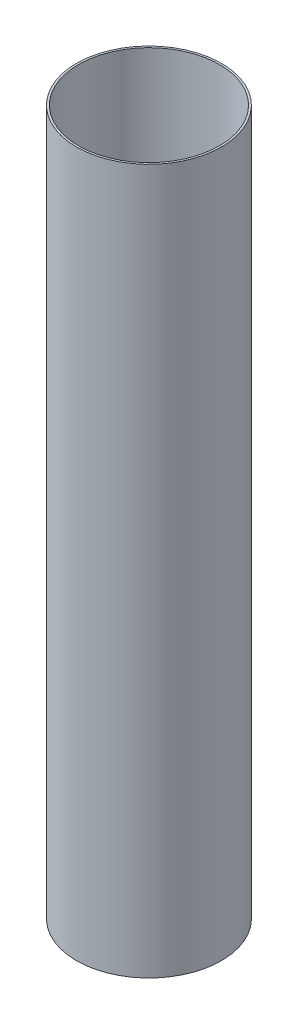
ISO-10303-21;
HEADER;
FILE_DESCRIPTION(('STEP AP214'),'2;1');
FILE_NAME('part.step','',(''),(''),'','','');
FILE_SCHEMA(('AUTOMOTIVE_DESIGN { 1 0 10303 214 1 1 1 1 }'));
ENDSEC;
DATA;
#1=APPLICATION_CONTEXT('core data for automotive mechanical design processes');
#2=APPLICATION_PROTOCOL_DEFINITION('international standard','automotive_design',2000,#1);
#3=PRODUCT_CONTEXT('',#1,'mechanical');
#4=PRODUCT('Part','Part','',(#3));
#5=PRODUCT_RELATED_PRODUCT_CATEGORY('part','',(#4));
#6=PRODUCT_DEFINITION_FORMATION('','',#4);
#7=PRODUCT_DEFINITION_CONTEXT('part definition',#1,'design');
#8=PRODUCT_DEFINITION('design','',#6,#7);
#9=PRODUCT_DEFINITION_SHAPE('','',#8);
#10=(LENGTH_UNIT() NAMED_UNIT(*) SI_UNIT(.MILLI.,.METRE.));
#11=(NAMED_UNIT(*) PLANE_ANGLE_UNIT() SI_UNIT($,.RADIAN.));
#12=(NAMED_UNIT(*) SI_UNIT($,.STERADIAN.) SOLID_ANGLE_UNIT());
#13=UNCERTAINTY_MEASURE_WITH_UNIT(LENGTH_MEASURE(1.E-05),#10,'distance_accuracy_value','');
#14=(GEOMETRIC_REPRESENTATION_CONTEXT(3) GLOBAL_UNCERTAINTY_ASSIGNED_CONTEXT((#13)) GLOBAL_UNIT_ASSIGNED_CONTEXT((#10,
#11,#12)) REPRESENTATION_CONTEXT('',''));
#15=CARTESIAN_POINT('',(0.,0.,0.));
#16=DIRECTION('',(0.,0.,1.));
#17=DIRECTION('',(1.,0.,0.));
#18=AXIS2_PLACEMENT_3D('',#15,#16,#17);
#19=CARTESIAN_POINT('',(0.,762.,0.));
#20=DIRECTION('',(0.,1.,0.));
#21=DIRECTION('',(0.,0.,1.));
#22=AXIS2_PLACEMENT_3D('',#19,#20,#21);
#23=PLANE('',#22);
#24=CARTESIAN_POINT('',(0.,762.,0.));
#25=DIRECTION('',(0.,1.,0.));
#26=DIRECTION('',(0.,0.,1.));
#27=AXIS2_PLACEMENT_3D('',#24,#25,#26);
#28=CIRCLE('',#27,78.359);
#29=CARTESIAN_POINT('',(0.,762.,78.359));
#30=VERTEX_POINT('',#29);
#31=EDGE_CURVE('E10',#30,#30,#28,.T.);
#32=ORIENTED_EDGE('',*,*,#31,.T.);
#33=EDGE_LOOP('',(#32));
#34=FACE_BOUND('',#33,.T.);
#35=CARTESIAN_POINT('',(0.,762.,0.));
#36=DIRECTION('',(0.,1.,0.));
#37=DIRECTION('',(0.,0.,1.));
#38=AXIS2_PLACEMENT_3D('',#35,#36,#37);
#39=CIRCLE('',#38,76.2);
#40=CARTESIAN_POINT('',(0.,762.,76.2));
#41=VERTEX_POINT('',#40);
#42=EDGE_CURVE('E42',#41,#41,#39,.T.);
#43=ORIENTED_EDGE('',*,*,#42,.F.);
#44=EDGE_LOOP('',(#43));
#45=FACE_BOUND('',#44,.T.);
#46=ADVANCED_FACE('F31',(#34,#45),#23,.T.);
#47=CARTESIAN_POINT('',(0.,0.,0.));
#48=DIRECTION('',(0.,1.,0.));
#49=DIRECTION('',(0.,0.,1.));
#50=AXIS2_PLACEMENT_3D('',#47,#48,#49);
#51=PLANE('',#50);
#52=CARTESIAN_POINT('',(0.,0.,0.));
#53=DIRECTION('',(0.,1.,0.));
#54=DIRECTION('',(0.,0.,1.));
#55=AXIS2_PLACEMENT_3D('',#52,#53,#54);
#56=CIRCLE('',#55,78.359);
#57=CARTESIAN_POINT('',(0.,0.,78.359));
#58=VERTEX_POINT('',#57);
#59=EDGE_CURVE('E35',#58,#58,#56,.T.);
#60=ORIENTED_EDGE('',*,*,#59,.F.);
#61=EDGE_LOOP('',(#60));
#62=FACE_BOUND('',#61,.T.);
#63=CARTESIAN_POINT('',(0.,0.,0.));
#64=DIRECTION('',(0.,1.,0.));
#65=DIRECTION('',(0.,0.,1.));
#66=AXIS2_PLACEMENT_3D('',#63,#64,#65);
#67=CIRCLE('',#66,76.2);
#68=CARTESIAN_POINT('',(0.,0.,76.2));
#69=VERTEX_POINT('',#68);
#70=EDGE_CURVE('E44',#69,#69,#67,.T.);
#71=ORIENTED_EDGE('',*,*,#70,.T.);
#72=EDGE_LOOP('',(#71));
#73=FACE_BOUND('',#72,.T.);
#74=ADVANCED_FACE('F54',(#62,#73),#51,.F.);
#75=CARTESIAN_POINT('',(0.,762.,0.));
#76=DIRECTION('',(0.,-1.,0.));
#77=DIRECTION('',(0.,0.,-1.));
#78=AXIS2_PLACEMENT_3D('',#75,#76,#77);
#79=CYLINDRICAL_SURFACE('',#78,78.359);
#80=ORIENTED_EDGE('',*,*,#31,.F.);
#81=EDGE_LOOP('',(#80));
#82=FACE_BOUND('',#81,.T.);
#83=ORIENTED_EDGE('',*,*,#59,.T.);
#84=EDGE_LOOP('',(#83));
#85=FACE_BOUND('',#84,.T.);
#86=ADVANCED_FACE('F33',(#82,#85),#79,.T.);
#87=CARTESIAN_POINT('',(0.,762.,0.));
#88=DIRECTION('',(0.,-1.,0.));
#89=DIRECTION('',(0.,0.,-1.));
#90=AXIS2_PLACEMENT_3D('',#87,#88,#89);
#91=CYLINDRICAL_SURFACE('',#90,76.2);
#92=ORIENTED_EDGE('',*,*,#42,.T.);
#93=EDGE_LOOP('',(#92));
#94=FACE_BOUND('',#93,.T.);
#95=ORIENTED_EDGE('',*,*,#70,.F.);
#96=EDGE_LOOP('',(#95));
#97=FACE_BOUND('',#96,.T.);
#98=ADVANCED_FACE('F50',(#94,#97),#91,.F.);
#99=CLOSED_SHELL('',(#46,#74,#86,#98));
#100=MANIFOLD_SOLID_BREP('B2',#99);
#101=ADVANCED_BREP_SHAPE_REPRESENTATION('',(#18,#100),#14);
#102=SHAPE_DEFINITION_REPRESENTATION(#9,#101);
ENDSEC;
END-ISO-10303-21;
